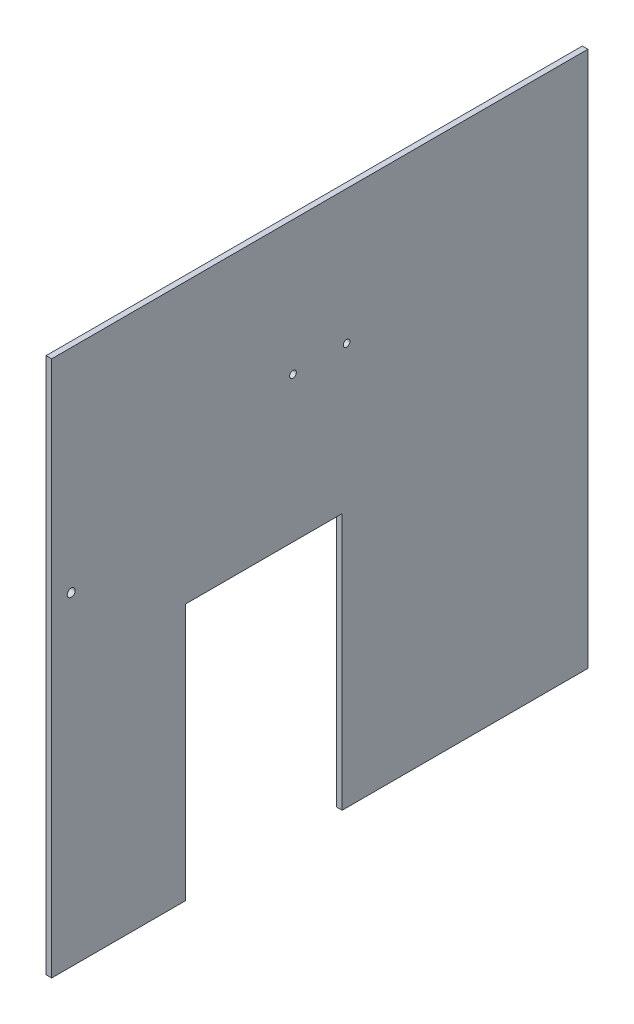
ISO-10303-21;
HEADER;
FILE_DESCRIPTION(('STEP AP214'),'2;1');
FILE_NAME('part.step','',(''),(''),'','','');
FILE_SCHEMA(('AUTOMOTIVE_DESIGN { 1 0 10303 214 1 1 1 1 }'));
ENDSEC;
DATA;
#1=APPLICATION_CONTEXT('core data for automotive mechanical design processes');
#2=APPLICATION_PROTOCOL_DEFINITION('international standard','automotive_design',2000,#1);
#3=PRODUCT_CONTEXT('',#1,'mechanical');
#4=PRODUCT('Part','Part','',(#3));
#5=PRODUCT_RELATED_PRODUCT_CATEGORY('part','',(#4));
#6=PRODUCT_DEFINITION_FORMATION('','',#4);
#7=PRODUCT_DEFINITION_CONTEXT('part definition',#1,'design');
#8=PRODUCT_DEFINITION('design','',#6,#7);
#9=PRODUCT_DEFINITION_SHAPE('','',#8);
#10=(LENGTH_UNIT() NAMED_UNIT(*) SI_UNIT(.MILLI.,.METRE.));
#11=(NAMED_UNIT(*) PLANE_ANGLE_UNIT() SI_UNIT($,.RADIAN.));
#12=(NAMED_UNIT(*) SI_UNIT($,.STERADIAN.) SOLID_ANGLE_UNIT());
#13=UNCERTAINTY_MEASURE_WITH_UNIT(LENGTH_MEASURE(1.E-05),#10,'distance_accuracy_value','');
#14=(GEOMETRIC_REPRESENTATION_CONTEXT(3) GLOBAL_UNCERTAINTY_ASSIGNED_CONTEXT((#13)) GLOBAL_UNIT_ASSIGNED_CONTEXT((#10,
#11,#12)) REPRESENTATION_CONTEXT('',''));
#15=CARTESIAN_POINT('',(0.,0.,0.));
#16=DIRECTION('',(0.,0.,1.));
#17=DIRECTION('',(1.,0.,0.));
#18=AXIS2_PLACEMENT_3D('',#15,#16,#17);
#19=CARTESIAN_POINT('',(3.175,0.,-12.7));
#20=DIRECTION('',(0.,0.,1.));
#21=DIRECTION('',(1.,0.,0.));
#22=AXIS2_PLACEMENT_3D('',#19,#20,#21);
#23=PLANE('',#22);
#24=DIRECTION('',(0.,1.,0.));
#25=VECTOR('',#24,1.);
#26=CARTESIAN_POINT('',(0.,0.,-12.7));
#27=LINE('',#26,#25);
#28=CARTESIAN_POINT('',(0.,-152.4,-12.7));
#29=VERTEX_POINT('',#28);
#30=CARTESIAN_POINT('',(0.,-6.34999999999999,-12.7));
#31=VERTEX_POINT('',#30);
#32=EDGE_CURVE('E145',#29,#31,#27,.T.);
#33=ORIENTED_EDGE('',*,*,#32,.F.);
#34=DIRECTION('',(-1.,0.,0.));
#35=VECTOR('',#34,1.);
#36=CARTESIAN_POINT('',(3.175,-152.4,-12.7));
#37=LINE('',#36,#35);
#38=CARTESIAN_POINT('',(3.175,-152.4,-12.7));
#39=VERTEX_POINT('',#38);
#40=EDGE_CURVE('E11',#39,#29,#37,.T.);
#41=ORIENTED_EDGE('',*,*,#40,.F.);
#42=DIRECTION('',(0.,1.,0.));
#43=VECTOR('',#42,1.);
#44=CARTESIAN_POINT('',(3.175,0.,-12.7));
#45=LINE('',#44,#43);
#46=CARTESIAN_POINT('',(3.175,-6.34999999999999,-12.7));
#47=VERTEX_POINT('',#46);
#48=EDGE_CURVE('E170',#39,#47,#45,.T.);
#49=ORIENTED_EDGE('',*,*,#48,.T.);
#50=DIRECTION('',(-1.,0.,0.));
#51=VECTOR('',#50,1.);
#52=CARTESIAN_POINT('',(3.175,-6.34999999999999,-12.7));
#53=LINE('',#52,#51);
#54=EDGE_CURVE('E96',#47,#31,#53,.T.);
#55=ORIENTED_EDGE('',*,*,#54,.T.);
#56=EDGE_LOOP('',(#33,#41,#49,#55));
#57=FACE_BOUND('',#56,.T.);
#58=ADVANCED_FACE('F44',(#57),#23,.T.);
#59=CARTESIAN_POINT('',(3.175,-152.4,0.));
#60=DIRECTION('',(0.,1.,0.));
#61=DIRECTION('',(0.,0.,1.));
#62=AXIS2_PLACEMENT_3D('',#59,#60,#61);
#63=PLANE('',#62);
#64=DIRECTION('',(0.,0.,-1.));
#65=VECTOR('',#64,1.);
#66=CARTESIAN_POINT('',(0.,-152.4,0.));
#67=LINE('',#66,#65);
#68=CARTESIAN_POINT('',(0.,-152.4,-152.4));
#69=VERTEX_POINT('',#68);
#70=EDGE_CURVE('E149',#29,#69,#67,.T.);
#71=ORIENTED_EDGE('',*,*,#70,.T.);
#72=DIRECTION('',(-1.,0.,0.));
#73=VECTOR('',#72,1.);
#74=CARTESIAN_POINT('',(3.175,-152.4,-152.4));
#75=LINE('',#74,#73);
#76=CARTESIAN_POINT('',(3.175,-152.4,-152.4));
#77=VERTEX_POINT('',#76);
#78=EDGE_CURVE('E53',#77,#69,#75,.T.);
#79=ORIENTED_EDGE('',*,*,#78,.F.);
#80=DIRECTION('',(0.,0.,-1.));
#81=VECTOR('',#80,1.);
#82=CARTESIAN_POINT('',(3.175,-152.4,0.));
#83=LINE('',#82,#81);
#84=EDGE_CURVE('E128',#39,#77,#83,.T.);
#85=ORIENTED_EDGE('',*,*,#84,.F.);
#86=ORIENTED_EDGE('',*,*,#40,.T.);
#87=EDGE_LOOP('',(#71,#79,#85,#86));
#88=FACE_BOUND('',#87,.T.);
#89=ADVANCED_FACE('F192',(#88),#63,.F.);
#90=CARTESIAN_POINT('',(3.175,0.,-152.4));
#91=DIRECTION('',(0.,0.,-1.));
#92=DIRECTION('',(0.,1.,0.));
#93=AXIS2_PLACEMENT_3D('',#90,#91,#92);
#94=PLANE('',#93);
#95=DIRECTION('',(0.,-1.,0.));
#96=VECTOR('',#95,1.);
#97=CARTESIAN_POINT('',(0.,0.,-152.4));
#98=LINE('',#97,#96);
#99=CARTESIAN_POINT('',(0.,152.4,-152.4));
#100=VERTEX_POINT('',#99);
#101=EDGE_CURVE('E154',#100,#69,#98,.T.);
#102=ORIENTED_EDGE('',*,*,#101,.F.);
#103=DIRECTION('',(-1.,0.,0.));
#104=VECTOR('',#103,1.);
#105=CARTESIAN_POINT('',(3.175,152.4,-152.4));
#106=LINE('',#105,#104);
#107=CARTESIAN_POINT('',(3.175,152.4,-152.4));
#108=VERTEX_POINT('',#107);
#109=EDGE_CURVE('E180',#108,#100,#106,.T.);
#110=ORIENTED_EDGE('',*,*,#109,.F.);
#111=DIRECTION('',(0.,-1.,0.));
#112=VECTOR('',#111,1.);
#113=CARTESIAN_POINT('',(3.175,0.,-152.4));
#114=LINE('',#113,#112);
#115=EDGE_CURVE('E189',#108,#77,#114,.T.);
#116=ORIENTED_EDGE('',*,*,#115,.T.);
#117=ORIENTED_EDGE('',*,*,#78,.T.);
#118=EDGE_LOOP('',(#102,#110,#116,#117));
#119=FACE_BOUND('',#118,.T.);
#120=ADVANCED_FACE('F187',(#119),#94,.T.);
#121=CARTESIAN_POINT('',(3.175,152.4,0.));
#122=DIRECTION('',(0.,1.,0.));
#123=DIRECTION('',(0.,0.,1.));
#124=AXIS2_PLACEMENT_3D('',#121,#122,#123);
#125=PLANE('',#124);
#126=DIRECTION('',(0.,0.,-1.));
#127=VECTOR('',#126,1.);
#128=CARTESIAN_POINT('',(0.,152.4,0.));
#129=LINE('',#128,#127);
#130=CARTESIAN_POINT('',(0.,152.4,152.4));
#131=VERTEX_POINT('',#130);
#132=EDGE_CURVE('E158',#131,#100,#129,.T.);
#133=ORIENTED_EDGE('',*,*,#132,.F.);
#134=DIRECTION('',(-1.,0.,0.));
#135=VECTOR('',#134,1.);
#136=CARTESIAN_POINT('',(3.175,152.4,152.4));
#137=LINE('',#136,#135);
#138=CARTESIAN_POINT('',(3.175,152.4,152.4));
#139=VERTEX_POINT('',#138);
#140=EDGE_CURVE('E177',#139,#131,#137,.T.);
#141=ORIENTED_EDGE('',*,*,#140,.F.);
#142=DIRECTION('',(0.,0.,-1.));
#143=VECTOR('',#142,1.);
#144=CARTESIAN_POINT('',(3.175,152.4,0.));
#145=LINE('',#144,#143);
#146=EDGE_CURVE('E200',#139,#108,#145,.T.);
#147=ORIENTED_EDGE('',*,*,#146,.T.);
#148=ORIENTED_EDGE('',*,*,#109,.T.);
#149=EDGE_LOOP('',(#133,#141,#147,#148));
#150=FACE_BOUND('',#149,.T.);
#151=ADVANCED_FACE('F198',(#150),#125,.T.);
#152=CARTESIAN_POINT('',(3.175,0.,152.4));
#153=DIRECTION('',(0.,0.,-1.));
#154=DIRECTION('',(0.,1.,0.));
#155=AXIS2_PLACEMENT_3D('',#152,#153,#154);
#156=PLANE('',#155);
#157=DIRECTION('',(0.,-1.,0.));
#158=VECTOR('',#157,1.);
#159=CARTESIAN_POINT('',(0.,0.,152.4));
#160=LINE('',#159,#158);
#161=CARTESIAN_POINT('',(0.,-152.4,152.4));
#162=VERTEX_POINT('',#161);
#163=EDGE_CURVE('E162',#131,#162,#160,.T.);
#164=ORIENTED_EDGE('',*,*,#163,.T.);
#165=DIRECTION('',(-1.,0.,0.));
#166=VECTOR('',#165,1.);
#167=CARTESIAN_POINT('',(3.175,-152.4,152.4));
#168=LINE('',#167,#166);
#169=CARTESIAN_POINT('',(3.175,-152.4,152.4));
#170=VERTEX_POINT('',#169);
#171=EDGE_CURVE('E134',#170,#162,#168,.T.);
#172=ORIENTED_EDGE('',*,*,#171,.F.);
#173=DIRECTION('',(0.,-1.,0.));
#174=VECTOR('',#173,1.);
#175=CARTESIAN_POINT('',(3.175,0.,152.4));
#176=LINE('',#175,#174);
#177=EDGE_CURVE('E122',#139,#170,#176,.T.);
#178=ORIENTED_EDGE('',*,*,#177,.F.);
#179=ORIENTED_EDGE('',*,*,#140,.T.);
#180=EDGE_LOOP('',(#164,#172,#178,#179));
#181=FACE_BOUND('',#180,.T.);
#182=ADVANCED_FACE('F271',(#181),#156,.F.);
#183=CARTESIAN_POINT('',(0.,-152.4,76.2));
#184=VERTEX_POINT('',#183);
#185=EDGE_CURVE('E132',#162,#184,#67,.T.);
#186=ORIENTED_EDGE('',*,*,#185,.T.);
#187=DIRECTION('',(-1.,0.,0.));
#188=VECTOR('',#187,1.);
#189=CARTESIAN_POINT('',(3.175,-152.4,76.2));
#190=LINE('',#189,#188);
#191=CARTESIAN_POINT('',(3.175,-152.4,76.2));
#192=VERTEX_POINT('',#191);
#193=EDGE_CURVE('E129',#192,#184,#190,.T.);
#194=ORIENTED_EDGE('',*,*,#193,.F.);
#195=EDGE_CURVE('E115',#170,#192,#83,.T.);
#196=ORIENTED_EDGE('',*,*,#195,.F.);
#197=ORIENTED_EDGE('',*,*,#171,.T.);
#198=EDGE_LOOP('',(#186,#194,#196,#197));
#199=FACE_BOUND('',#198,.T.);
#200=ADVANCED_FACE('F130',(#199),#63,.F.);
#201=CARTESIAN_POINT('',(3.175,0.,76.2));
#202=DIRECTION('',(0.,0.,1.));
#203=DIRECTION('',(1.,0.,0.));
#204=AXIS2_PLACEMENT_3D('',#201,#202,#203);
#205=PLANE('',#204);
#206=DIRECTION('',(0.,1.,0.));
#207=VECTOR('',#206,1.);
#208=CARTESIAN_POINT('',(0.,0.,76.2));
#209=LINE('',#208,#207);
#210=CARTESIAN_POINT('',(0.,-6.34999999999999,76.2));
#211=VERTEX_POINT('',#210);
#212=EDGE_CURVE('E89',#184,#211,#209,.T.);
#213=ORIENTED_EDGE('',*,*,#212,.T.);
#214=DIRECTION('',(-1.,0.,0.));
#215=VECTOR('',#214,1.);
#216=CARTESIAN_POINT('',(3.175,-6.34999999999999,76.2));
#217=LINE('',#216,#215);
#218=CARTESIAN_POINT('',(3.175,-6.34999999999999,76.2));
#219=VERTEX_POINT('',#218);
#220=EDGE_CURVE('E135',#219,#211,#217,.T.);
#221=ORIENTED_EDGE('',*,*,#220,.F.);
#222=DIRECTION('',(0.,1.,0.));
#223=VECTOR('',#222,1.);
#224=CARTESIAN_POINT('',(3.175,0.,76.2));
#225=LINE('',#224,#223);
#226=EDGE_CURVE('E119',#192,#219,#225,.T.);
#227=ORIENTED_EDGE('',*,*,#226,.F.);
#228=ORIENTED_EDGE('',*,*,#193,.T.);
#229=EDGE_LOOP('',(#213,#221,#227,#228));
#230=FACE_BOUND('',#229,.T.);
#231=ADVANCED_FACE('F137',(#230),#205,.F.);
#232=CARTESIAN_POINT('',(3.175,-6.34999999999999,0.));
#233=DIRECTION('',(0.,1.,0.));
#234=DIRECTION('',(0.,0.,1.));
#235=AXIS2_PLACEMENT_3D('',#232,#233,#234);
#236=PLANE('',#235);
#237=DIRECTION('',(0.,0.,-1.));
#238=VECTOR('',#237,1.);
#239=CARTESIAN_POINT('',(0.,-6.34999999999999,0.));
#240=LINE('',#239,#238);
#241=EDGE_CURVE('E167',#211,#31,#240,.T.);
#242=ORIENTED_EDGE('',*,*,#241,.T.);
#243=ORIENTED_EDGE('',*,*,#54,.F.);
#244=DIRECTION('',(0.,0.,-1.));
#245=VECTOR('',#244,1.);
#246=CARTESIAN_POINT('',(3.175,-6.34999999999999,0.));
#247=LINE('',#246,#245);
#248=EDGE_CURVE('E61',#219,#47,#247,.T.);
#249=ORIENTED_EDGE('',*,*,#248,.F.);
#250=ORIENTED_EDGE('',*,*,#220,.T.);
#251=EDGE_LOOP('',(#242,#243,#249,#250));
#252=FACE_BOUND('',#251,.T.);
#253=ADVANCED_FACE('F236',(#252),#236,.F.);
#254=CARTESIAN_POINT('',(3.175,0.,0.));
#255=DIRECTION('',(1.,0.,0.));
#256=DIRECTION('',(0.,0.,-1.));
#257=AXIS2_PLACEMENT_3D('',#254,#255,#256);
#258=PLANE('',#257);
#259=CARTESIAN_POINT('',(3.175,76.2,15.24));
#260=DIRECTION('',(1.,0.,0.));
#261=DIRECTION('',(0.,0.,-1.));
#262=AXIS2_PLACEMENT_3D('',#259,#260,#261);
#263=CIRCLE('',#262,1.90499999999999);
#264=CARTESIAN_POINT('',(3.175,76.2,13.335));
#265=VERTEX_POINT('',#264);
#266=EDGE_CURVE('E227',#265,#265,#263,.T.);
#267=ORIENTED_EDGE('',*,*,#266,.F.);
#268=EDGE_LOOP('',(#267));
#269=FACE_BOUND('',#268,.T.);
#270=CARTESIAN_POINT('',(3.175,76.2,-15.24));
#271=DIRECTION('',(1.,0.,0.));
#272=DIRECTION('',(0.,0.,-1.));
#273=AXIS2_PLACEMENT_3D('',#270,#271,#272);
#274=CIRCLE('',#273,1.90499999999999);
#275=CARTESIAN_POINT('',(3.175,76.2,-17.145));
#276=VERTEX_POINT('',#275);
#277=EDGE_CURVE('E219',#276,#276,#274,.T.);
#278=ORIENTED_EDGE('',*,*,#277,.F.);
#279=EDGE_LOOP('',(#278));
#280=FACE_BOUND('',#279,.T.);
#281=CARTESIAN_POINT('',(3.175,31.75,141.2875));
#282=DIRECTION('',(1.,0.,0.));
#283=DIRECTION('',(0.,0.,-1.));
#284=AXIS2_PLACEMENT_3D('',#281,#282,#283);
#285=CIRCLE('',#284,2.28600000000001);
#286=CARTESIAN_POINT('',(3.175,31.75,139.0015));
#287=VERTEX_POINT('',#286);
#288=EDGE_CURVE('E208',#287,#287,#285,.T.);
#289=ORIENTED_EDGE('',*,*,#288,.F.);
#290=EDGE_LOOP('',(#289));
#291=FACE_BOUND('',#290,.T.);
#292=ORIENTED_EDGE('',*,*,#48,.F.);
#293=ORIENTED_EDGE('',*,*,#84,.T.);
#294=ORIENTED_EDGE('',*,*,#115,.F.);
#295=ORIENTED_EDGE('',*,*,#146,.F.);
#296=ORIENTED_EDGE('',*,*,#177,.T.);
#297=ORIENTED_EDGE('',*,*,#195,.T.);
#298=ORIENTED_EDGE('',*,*,#226,.T.);
#299=ORIENTED_EDGE('',*,*,#248,.T.);
#300=EDGE_LOOP('',(#292,#293,#294,#295,#296,#297,#298,#299));
#301=FACE_BOUND('',#300,.T.);
#302=ADVANCED_FACE('F117',(#269,#280,#291,#301),#258,.T.);
#303=CARTESIAN_POINT('',(0.,0.,0.));
#304=DIRECTION('',(1.,0.,0.));
#305=DIRECTION('',(0.,0.,-1.));
#306=AXIS2_PLACEMENT_3D('',#303,#304,#305);
#307=PLANE('',#306);
#308=CARTESIAN_POINT('',(0.,76.2,15.24));
#309=DIRECTION('',(1.,0.,0.));
#310=DIRECTION('',(0.,0.,-1.));
#311=AXIS2_PLACEMENT_3D('',#308,#309,#310);
#312=CIRCLE('',#311,1.90499999999999);
#313=CARTESIAN_POINT('',(0.,76.2,13.335));
#314=VERTEX_POINT('',#313);
#315=EDGE_CURVE('E223',#314,#314,#312,.T.);
#316=ORIENTED_EDGE('',*,*,#315,.T.);
#317=EDGE_LOOP('',(#316));
#318=FACE_BOUND('',#317,.T.);
#319=CARTESIAN_POINT('',(0.,76.2,-15.24));
#320=DIRECTION('',(1.,0.,0.));
#321=DIRECTION('',(0.,0.,-1.));
#322=AXIS2_PLACEMENT_3D('',#319,#320,#321);
#323=CIRCLE('',#322,1.90499999999999);
#324=CARTESIAN_POINT('',(0.,76.2,-17.145));
#325=VERTEX_POINT('',#324);
#326=EDGE_CURVE('E212',#325,#325,#323,.T.);
#327=ORIENTED_EDGE('',*,*,#326,.T.);
#328=EDGE_LOOP('',(#327));
#329=FACE_BOUND('',#328,.T.);
#330=CARTESIAN_POINT('',(0.,31.75,141.2875));
#331=DIRECTION('',(1.,0.,0.));
#332=DIRECTION('',(0.,0.,-1.));
#333=AXIS2_PLACEMENT_3D('',#330,#331,#332);
#334=CIRCLE('',#333,2.28600000000001);
#335=CARTESIAN_POINT('',(0.,31.75,139.0015));
#336=VERTEX_POINT('',#335);
#337=EDGE_CURVE('E150',#336,#336,#334,.T.);
#338=ORIENTED_EDGE('',*,*,#337,.T.);
#339=EDGE_LOOP('',(#338));
#340=FACE_BOUND('',#339,.T.);
#341=ORIENTED_EDGE('',*,*,#32,.T.);
#342=ORIENTED_EDGE('',*,*,#241,.F.);
#343=ORIENTED_EDGE('',*,*,#212,.F.);
#344=ORIENTED_EDGE('',*,*,#185,.F.);
#345=ORIENTED_EDGE('',*,*,#163,.F.);
#346=ORIENTED_EDGE('',*,*,#132,.T.);
#347=ORIENTED_EDGE('',*,*,#101,.T.);
#348=ORIENTED_EDGE('',*,*,#70,.F.);
#349=EDGE_LOOP('',(#341,#342,#343,#344,#345,#346,#347,#348));
#350=FACE_BOUND('',#349,.T.);
#351=ADVANCED_FACE('F194',(#318,#329,#340,#350),#307,.F.);
#352=CARTESIAN_POINT('',(0.,31.75,141.2875));
#353=DIRECTION('',(1.,0.,0.));
#354=DIRECTION('',(0.,0.,-1.));
#355=AXIS2_PLACEMENT_3D('',#352,#353,#354);
#356=CYLINDRICAL_SURFACE('',#355,2.28600000000001);
#357=ORIENTED_EDGE('',*,*,#337,.F.);
#358=EDGE_LOOP('',(#357));
#359=FACE_BOUND('',#358,.T.);
#360=ORIENTED_EDGE('',*,*,#288,.T.);
#361=EDGE_LOOP('',(#360));
#362=FACE_BOUND('',#361,.T.);
#363=ADVANCED_FACE('F242',(#359,#362),#356,.F.);
#364=CARTESIAN_POINT('',(3.175,76.2,-15.24));
#365=DIRECTION('',(1.,0.,0.));
#366=DIRECTION('',(0.,0.,-1.));
#367=AXIS2_PLACEMENT_3D('',#364,#365,#366);
#368=CYLINDRICAL_SURFACE('',#367,1.90499999999999);
#369=ORIENTED_EDGE('',*,*,#326,.F.);
#370=EDGE_LOOP('',(#369));
#371=FACE_BOUND('',#370,.T.);
#372=ORIENTED_EDGE('',*,*,#277,.T.);
#373=EDGE_LOOP('',(#372));
#374=FACE_BOUND('',#373,.T.);
#375=ADVANCED_FACE('F244',(#371,#374),#368,.F.);
#376=CARTESIAN_POINT('',(3.175,76.2,15.24));
#377=DIRECTION('',(1.,0.,0.));
#378=DIRECTION('',(0.,0.,-1.));
#379=AXIS2_PLACEMENT_3D('',#376,#377,#378);
#380=CYLINDRICAL_SURFACE('',#379,1.90499999999999);
#381=ORIENTED_EDGE('',*,*,#315,.F.);
#382=EDGE_LOOP('',(#381));
#383=FACE_BOUND('',#382,.T.);
#384=ORIENTED_EDGE('',*,*,#266,.T.);
#385=EDGE_LOOP('',(#384));
#386=FACE_BOUND('',#385,.T.);
#387=ADVANCED_FACE('F232',(#383,#386),#380,.F.);
#388=CLOSED_SHELL('',(#58,#89,#120,#151,#182,#200,#231,#253,#302,#351,#363,#375,#387));
#389=MANIFOLD_SOLID_BREP('B2',#388);
#390=ADVANCED_BREP_SHAPE_REPRESENTATION('',(#18,#389),#14);
#391=SHAPE_DEFINITION_REPRESENTATION(#9,#390);
ENDSEC;
END-ISO-10303-21;
